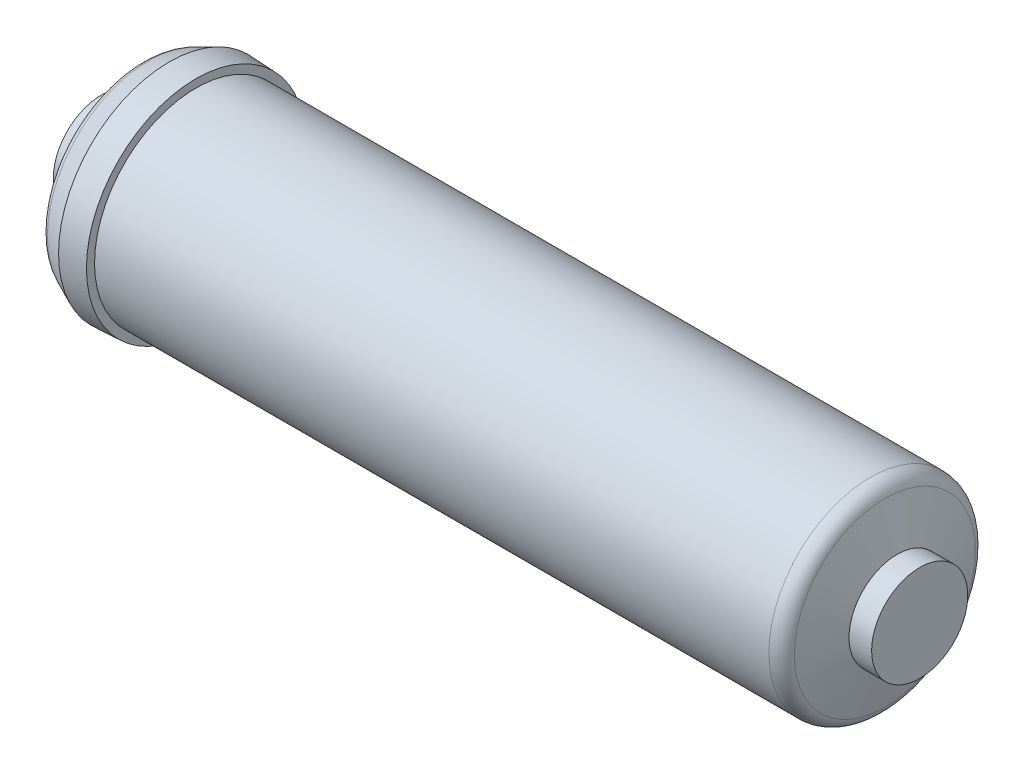
ISO-10303-21;
HEADER;
FILE_DESCRIPTION(('STEP AP214'),'2;1');
FILE_NAME('part.step','',(''),(''),'','','');
FILE_SCHEMA(('AUTOMOTIVE_DESIGN { 1 0 10303 214 1 1 1 1 }'));
ENDSEC;
DATA;
#1=APPLICATION_CONTEXT('core data for automotive mechanical design processes');
#2=APPLICATION_PROTOCOL_DEFINITION('international standard','automotive_design',2000,#1);
#3=PRODUCT_CONTEXT('',#1,'mechanical');
#4=PRODUCT('Part','Part','',(#3));
#5=PRODUCT_RELATED_PRODUCT_CATEGORY('part','',(#4));
#6=PRODUCT_DEFINITION_FORMATION('','',#4);
#7=PRODUCT_DEFINITION_CONTEXT('part definition',#1,'design');
#8=PRODUCT_DEFINITION('design','',#6,#7);
#9=PRODUCT_DEFINITION_SHAPE('','',#8);
#10=(LENGTH_UNIT() NAMED_UNIT(*) SI_UNIT(.MILLI.,.METRE.));
#11=(NAMED_UNIT(*) PLANE_ANGLE_UNIT() SI_UNIT($,.RADIAN.));
#12=(NAMED_UNIT(*) SI_UNIT($,.STERADIAN.) SOLID_ANGLE_UNIT());
#13=UNCERTAINTY_MEASURE_WITH_UNIT(LENGTH_MEASURE(1.E-05),#10,'distance_accuracy_value','');
#14=(GEOMETRIC_REPRESENTATION_CONTEXT(3) GLOBAL_UNCERTAINTY_ASSIGNED_CONTEXT((#13)) GLOBAL_UNIT_ASSIGNED_CONTEXT((#10,
#11,#12)) REPRESENTATION_CONTEXT('',''));
#15=CARTESIAN_POINT('',(0.,0.,0.));
#16=DIRECTION('',(0.,0.,1.));
#17=DIRECTION('',(1.,0.,0.));
#18=AXIS2_PLACEMENT_3D('',#15,#16,#17);
#19=CARTESIAN_POINT('',(257.175,0.,0.));
#20=DIRECTION('',(-1.,0.,0.));
#21=DIRECTION('',(0.,0.,1.));
#22=AXIS2_PLACEMENT_3D('',#19,#20,#21);
#23=PLANE('',#22);
#24=CARTESIAN_POINT('',(257.175,0.,0.));
#25=DIRECTION('',(-1.,0.,0.));
#26=DIRECTION('',(0.,0.,1.));
#27=AXIS2_PLACEMENT_3D('',#24,#25,#26);
#28=CIRCLE('',#27,15.113);
#29=CARTESIAN_POINT('',(257.175,0.,15.113));
#30=VERTEX_POINT('',#29);
#31=EDGE_CURVE('E69',#30,#30,#28,.T.);
#32=ORIENTED_EDGE('',*,*,#31,.F.);
#33=EDGE_LOOP('',(#32));
#34=FACE_BOUND('',#33,.T.);
#35=ADVANCED_FACE('F43',(#34),#23,.F.);
#36=CARTESIAN_POINT('',(0.,0.,0.));
#37=DIRECTION('',(-1.,0.,0.));
#38=DIRECTION('',(0.,0.,1.));
#39=AXIS2_PLACEMENT_3D('',#36,#37,#38);
#40=CYLINDRICAL_SURFACE('',#39,15.113);
#41=CARTESIAN_POINT('',(250.063,0.,0.));
#42=DIRECTION('',(-1.,0.,0.));
#43=DIRECTION('',(0.,0.,1.));
#44=AXIS2_PLACEMENT_3D('',#41,#42,#43);
#45=CIRCLE('',#44,15.113);
#46=CARTESIAN_POINT('',(250.063,0.,15.113));
#47=VERTEX_POINT('',#46);
#48=EDGE_CURVE('E73',#47,#47,#45,.T.);
#49=ORIENTED_EDGE('',*,*,#48,.F.);
#50=EDGE_LOOP('',(#49));
#51=FACE_BOUND('',#50,.T.);
#52=ORIENTED_EDGE('',*,*,#31,.T.);
#53=EDGE_LOOP('',(#52));
#54=FACE_BOUND('',#53,.T.);
#55=ADVANCED_FACE('F115',(#51,#54),#40,.T.);
#56=CARTESIAN_POINT('',(250.063,0.,0.));
#57=DIRECTION('',(-1.,0.,0.));
#58=DIRECTION('',(0.,0.,1.));
#59=AXIS2_PLACEMENT_3D('',#56,#57,#58);
#60=CONICAL_SURFACE('',#59,15.113,1.29049667045645);
#61=CARTESIAN_POINT('',(246.228738033462,0.,0.));
#62=DIRECTION('',(1.,0.,0.));
#63=DIRECTION('',(0.,0.,-1.));
#64=AXIS2_PLACEMENT_3D('',#61,#62,#63);
#65=CIRCLE('',#64,28.4320152521847);
#66=CARTESIAN_POINT('',(246.228738033462,0.,-28.4320152521847));
#67=VERTEX_POINT('',#66);
#68=EDGE_CURVE('E10',#67,#67,#65,.T.);
#69=ORIENTED_EDGE('',*,*,#68,.T.);
#70=EDGE_LOOP('',(#69));
#71=FACE_BOUND('',#70,.T.);
#72=ORIENTED_EDGE('',*,*,#48,.T.);
#73=EDGE_LOOP('',(#72));
#74=FACE_BOUND('',#73,.T.);
#75=ADVANCED_FACE('F121',(#71,#74),#60,.T.);
#76=CARTESIAN_POINT('',(0.,0.,0.));
#77=DIRECTION('',(-1.,0.,0.));
#78=DIRECTION('',(0.,0.,1.));
#79=AXIS2_PLACEMENT_3D('',#76,#77,#78);
#80=CYLINDRICAL_SURFACE('',#79,31.877);
#81=CARTESIAN_POINT('',(241.65210610482,0.,0.));
#82=DIRECTION('',(1.,0.,0.));
#83=DIRECTION('',(0.,0.,-1.));
#84=AXIS2_PLACEMENT_3D('',#81,#82,#83);
#85=CIRCLE('',#84,31.877);
#86=CARTESIAN_POINT('',(241.65210610482,0.,-31.877));
#87=VERTEX_POINT('',#86);
#88=EDGE_CURVE('E51',#87,#87,#85,.F.);
#89=ORIENTED_EDGE('',*,*,#88,.T.);
#90=EDGE_LOOP('',(#89));
#91=FACE_BOUND('',#90,.T.);
#92=CARTESIAN_POINT('',(29.718,0.,0.));
#93=DIRECTION('',(-1.,0.,0.));
#94=DIRECTION('',(0.,0.,1.));
#95=AXIS2_PLACEMENT_3D('',#92,#93,#94);
#96=CIRCLE('',#95,31.877);
#97=CARTESIAN_POINT('',(29.718,0.,31.877));
#98=VERTEX_POINT('',#97);
#99=EDGE_CURVE('E76',#98,#98,#96,.T.);
#100=ORIENTED_EDGE('',*,*,#99,.F.);
#101=EDGE_LOOP('',(#100));
#102=FACE_BOUND('',#101,.T.);
#103=ADVANCED_FACE('F148',(#91,#102),#80,.T.);
#104=CARTESIAN_POINT('',(29.718,31.877,0.));
#105=DIRECTION('',(-1.,0.,0.));
#106=DIRECTION('',(0.,0.,1.));
#107=AXIS2_PLACEMENT_3D('',#104,#105,#106);
#108=PLANE('',#107);
#109=CARTESIAN_POINT('',(29.718,0.,0.));
#110=DIRECTION('',(-1.,0.,0.));
#111=DIRECTION('',(0.,0.,1.));
#112=AXIS2_PLACEMENT_3D('',#109,#110,#111);
#113=CIRCLE('',#112,34.417);
#114=CARTESIAN_POINT('',(29.718,0.,34.417));
#115=VERTEX_POINT('',#114);
#116=EDGE_CURVE('E79',#115,#115,#113,.T.);
#117=ORIENTED_EDGE('',*,*,#116,.F.);
#118=EDGE_LOOP('',(#117));
#119=FACE_BOUND('',#118,.T.);
#120=ORIENTED_EDGE('',*,*,#99,.T.);
#121=EDGE_LOOP('',(#120));
#122=FACE_BOUND('',#121,.T.);
#123=ADVANCED_FACE('F142',(#119,#122),#108,.F.);
#124=CARTESIAN_POINT('',(29.718,0.,0.));
#125=DIRECTION('',(-1.,0.,0.));
#126=DIRECTION('',(0.,0.,1.));
#127=AXIS2_PLACEMENT_3D('',#124,#125,#126);
#128=CONICAL_SURFACE('',#127,34.417,0.0454232794215811);
#129=CARTESIAN_POINT('',(21.336,0.,0.));
#130=DIRECTION('',(-1.,0.,0.));
#131=DIRECTION('',(0.,0.,1.));
#132=AXIS2_PLACEMENT_3D('',#129,#130,#131);
#133=CIRCLE('',#132,34.798);
#134=CARTESIAN_POINT('',(21.336,0.,34.798));
#135=VERTEX_POINT('',#134);
#136=EDGE_CURVE('E82',#135,#135,#133,.T.);
#137=ORIENTED_EDGE('',*,*,#136,.F.);
#138=EDGE_LOOP('',(#137));
#139=FACE_BOUND('',#138,.T.);
#140=ORIENTED_EDGE('',*,*,#116,.T.);
#141=EDGE_LOOP('',(#140));
#142=FACE_BOUND('',#141,.T.);
#143=ADVANCED_FACE('F111',(#139,#142),#128,.T.);
#144=CARTESIAN_POINT('',(21.336,0.,0.));
#145=DIRECTION('',(1.,0.,0.));
#146=DIRECTION('',(0.,0.,-1.));
#147=AXIS2_PLACEMENT_3D('',#144,#145,#146);
#148=CONICAL_SURFACE('',#147,34.798,0.426627493126876);
#149=CARTESIAN_POINT('',(14.8871174557822,0.,0.));
#150=DIRECTION('',(-1.,0.,0.));
#151=DIRECTION('',(0.,0.,1.));
#152=AXIS2_PLACEMENT_3D('',#149,#150,#151);
#153=CIRCLE('',#152,31.8666897526283);
#154=CARTESIAN_POINT('',(14.8871174557822,0.,31.8666897526283));
#155=VERTEX_POINT('',#154);
#156=EDGE_CURVE('E57',#155,#155,#153,.F.);
#157=ORIENTED_EDGE('',*,*,#156,.T.);
#158=EDGE_LOOP('',(#157));
#159=FACE_BOUND('',#158,.T.);
#160=ORIENTED_EDGE('',*,*,#136,.T.);
#161=EDGE_LOOP('',(#160));
#162=FACE_BOUND('',#161,.T.);
#163=ADVANCED_FACE('F103',(#159,#162),#148,.T.);
#164=CARTESIAN_POINT('',(12.954,0.,0.));
#165=DIRECTION('',(1.,0.,0.));
#166=DIRECTION('',(0.,0.,-1.));
#167=AXIS2_PLACEMENT_3D('',#164,#165,#166);
#168=CONICAL_SURFACE('',#167,30.988,1.26545356623705);
#169=CARTESIAN_POINT('',(12.3156483309774,0.,0.));
#170=DIRECTION('',(-1.,0.,0.));
#171=DIRECTION('',(0.,0.,1.));
#172=AXIS2_PLACEMENT_3D('',#169,#170,#171);
#173=CIRCLE('',#172,28.9627726236593);
#174=CARTESIAN_POINT('',(12.3156483309774,0.,28.9627726236593));
#175=VERTEX_POINT('',#174);
#176=EDGE_CURVE('E63',#175,#175,#173,.T.);
#177=ORIENTED_EDGE('',*,*,#176,.T.);
#178=EDGE_LOOP('',(#177));
#179=FACE_BOUND('',#178,.T.);
#180=CARTESIAN_POINT('',(7.9502,0.,0.));
#181=DIRECTION('',(-1.,0.,0.));
#182=DIRECTION('',(0.,0.,1.));
#183=AXIS2_PLACEMENT_3D('',#180,#181,#182);
#184=CIRCLE('',#183,15.113);
#185=CARTESIAN_POINT('',(7.9502,0.,15.113));
#186=VERTEX_POINT('',#185);
#187=EDGE_CURVE('E86',#186,#186,#184,.T.);
#188=ORIENTED_EDGE('',*,*,#187,.F.);
#189=EDGE_LOOP('',(#188));
#190=FACE_BOUND('',#189,.T.);
#191=ADVANCED_FACE('F98',(#179,#190),#168,.T.);
#192=CARTESIAN_POINT('',(0.,0.,0.));
#193=DIRECTION('',(-1.,0.,0.));
#194=DIRECTION('',(0.,0.,1.));
#195=AXIS2_PLACEMENT_3D('',#192,#193,#194);
#196=CYLINDRICAL_SURFACE('',#195,15.113);
#197=CARTESIAN_POINT('',(0.,0.,0.));
#198=DIRECTION('',(-1.,0.,0.));
#199=DIRECTION('',(0.,0.,1.));
#200=AXIS2_PLACEMENT_3D('',#197,#198,#199);
#201=CIRCLE('',#200,15.113);
#202=CARTESIAN_POINT('',(0.,0.,15.113));
#203=VERTEX_POINT('',#202);
#204=EDGE_CURVE('E89',#203,#203,#201,.T.);
#205=ORIENTED_EDGE('',*,*,#204,.F.);
#206=EDGE_LOOP('',(#205));
#207=FACE_BOUND('',#206,.T.);
#208=ORIENTED_EDGE('',*,*,#187,.T.);
#209=EDGE_LOOP('',(#208));
#210=FACE_BOUND('',#209,.T.);
#211=ADVANCED_FACE('F95',(#207,#210),#196,.T.);
#212=CARTESIAN_POINT('',(0.,15.113,0.));
#213=DIRECTION('',(1.,0.,0.));
#214=DIRECTION('',(0.,0.,-1.));
#215=AXIS2_PLACEMENT_3D('',#212,#213,#214);
#216=PLANE('',#215);
#217=ORIENTED_EDGE('',*,*,#204,.T.);
#218=EDGE_LOOP('',(#217));
#219=FACE_BOUND('',#218,.T.);
#220=ADVANCED_FACE('F93',(#219),#216,.F.);
#221=CARTESIAN_POINT('',(16.8578539780165,0.,0.));
#222=DIRECTION('',(1.,0.,0.));
#223=DIRECTION('',(0.,0.,-1.));
#224=AXIS2_PLACEMENT_3D('',#221,#222,#223);
#225=TOROIDAL_SURFACE('',#224,27.5310694037126,4.7625);
#226=ORIENTED_EDGE('',*,*,#156,.F.);
#227=EDGE_LOOP('',(#226));
#228=FACE_BOUND('',#227,.T.);
#229=ORIENTED_EDGE('',*,*,#176,.F.);
#230=EDGE_LOOP('',(#229));
#231=FACE_BOUND('',#230,.T.);
#232=ADVANCED_FACE('F126',(#228,#231),#225,.T.);
#233=CARTESIAN_POINT('',(241.65210610482,0.,0.));
#234=DIRECTION('',(1.,0.,0.));
#235=DIRECTION('',(0.,0.,-1.));
#236=AXIS2_PLACEMENT_3D('',#233,#234,#235);
#237=TOROIDAL_SURFACE('',#236,27.1145,4.7625);
#238=ORIENTED_EDGE('',*,*,#68,.F.);
#239=EDGE_LOOP('',(#238));
#240=FACE_BOUND('',#239,.T.);
#241=ORIENTED_EDGE('',*,*,#88,.F.);
#242=EDGE_LOOP('',(#241));
#243=FACE_BOUND('',#242,.T.);
#244=ADVANCED_FACE('F45',(#240,#243),#237,.T.);
#245=CLOSED_SHELL('',(#35,#55,#75,#103,#123,#143,#163,#191,#211,#220,#232,#244));
#246=MANIFOLD_SOLID_BREP('B2',#245);
#247=ADVANCED_BREP_SHAPE_REPRESENTATION('',(#18,#246),#14);
#248=SHAPE_DEFINITION_REPRESENTATION(#9,#247);
ENDSEC;
END-ISO-10303-21;
